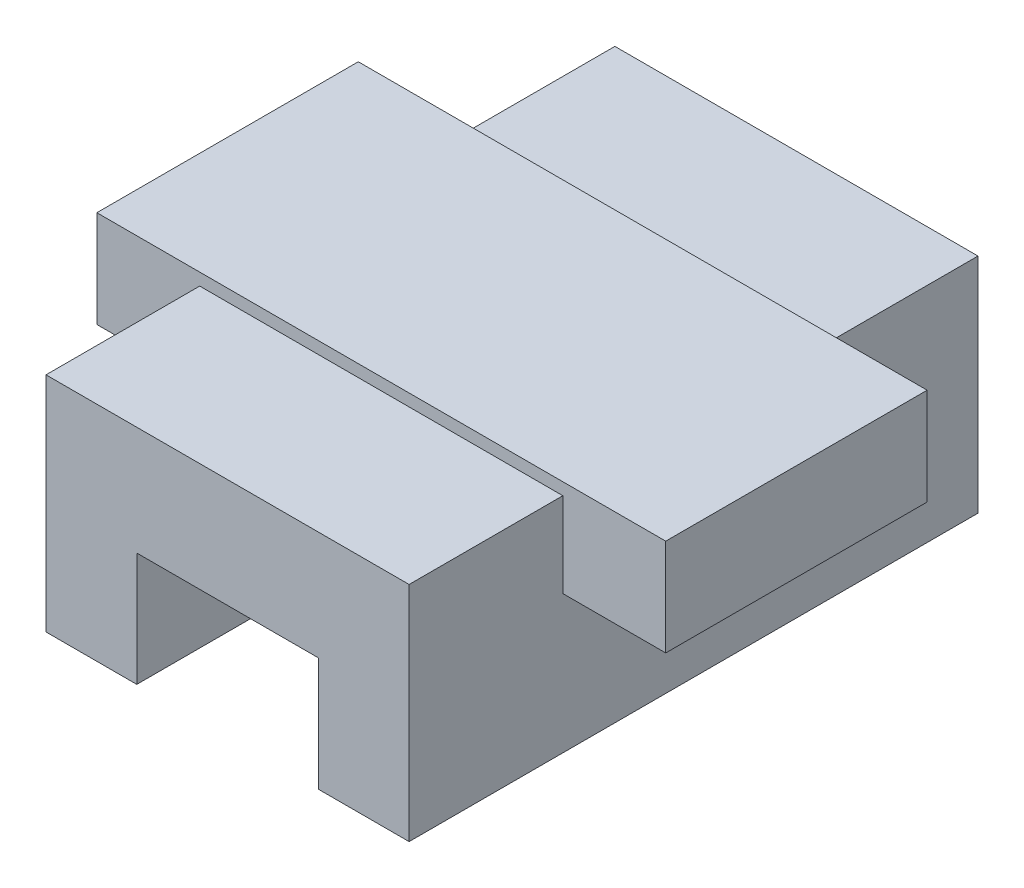
ISO-10303-21;
HEADER;
FILE_DESCRIPTION(('STEP AP214'),'2;1');
FILE_NAME('part.step','',(''),(''),'','','');
FILE_SCHEMA(('AUTOMOTIVE_DESIGN { 1 0 10303 214 1 1 1 1 }'));
ENDSEC;
DATA;
#1=APPLICATION_CONTEXT('core data for automotive mechanical design processes');
#2=APPLICATION_PROTOCOL_DEFINITION('international standard','automotive_design',2000,#1);
#3=PRODUCT_CONTEXT('',#1,'mechanical');
#4=PRODUCT('Part','Part','',(#3));
#5=PRODUCT_RELATED_PRODUCT_CATEGORY('part','',(#4));
#6=PRODUCT_DEFINITION_FORMATION('','',#4);
#7=PRODUCT_DEFINITION_CONTEXT('part definition',#1,'design');
#8=PRODUCT_DEFINITION('design','',#6,#7);
#9=PRODUCT_DEFINITION_SHAPE('','',#8);
#10=(LENGTH_UNIT() NAMED_UNIT(*) SI_UNIT(.MILLI.,.METRE.));
#11=(NAMED_UNIT(*) PLANE_ANGLE_UNIT() SI_UNIT($,.RADIAN.));
#12=(NAMED_UNIT(*) SI_UNIT($,.STERADIAN.) SOLID_ANGLE_UNIT());
#13=UNCERTAINTY_MEASURE_WITH_UNIT(LENGTH_MEASURE(1.E-05),#10,'distance_accuracy_value','');
#14=(GEOMETRIC_REPRESENTATION_CONTEXT(3) GLOBAL_UNCERTAINTY_ASSIGNED_CONTEXT((#13)) GLOBAL_UNIT_ASSIGNED_CONTEXT((#10,
#11,#12)) REPRESENTATION_CONTEXT('',''));
#15=CARTESIAN_POINT('',(0.,0.,0.));
#16=DIRECTION('',(0.,0.,1.));
#17=DIRECTION('',(1.,0.,0.));
#18=AXIS2_PLACEMENT_3D('',#15,#16,#17);
#19=CARTESIAN_POINT('',(0.,16.,23.5));
#20=DIRECTION('',(0.,-1.,0.));
#21=DIRECTION('',(1.,0.,0.));
#22=AXIS2_PLACEMENT_3D('',#19,#20,#21);
#23=PLANE('',#22);
#24=DIRECTION('',(-1.,0.,0.));
#25=VECTOR('',#24,1.);
#26=CARTESIAN_POINT('',(0.,16.,-10.8));
#27=LINE('',#26,#25);
#28=CARTESIAN_POINT('',(15.,16.,-10.8));
#29=VERTEX_POINT('',#28);
#30=CARTESIAN_POINT('',(-15.,16.,-10.8));
#31=VERTEX_POINT('',#30);
#32=EDGE_CURVE('E50',#29,#31,#27,.T.);
#33=ORIENTED_EDGE('',*,*,#32,.F.);
#34=DIRECTION('',(0.,0.,-1.));
#35=VECTOR('',#34,1.);
#36=CARTESIAN_POINT('',(15.,16.,23.5));
#37=LINE('',#36,#35);
#38=CARTESIAN_POINT('',(15.,16.,-23.5));
#39=VERTEX_POINT('',#38);
#40=EDGE_CURVE('E43',#29,#39,#37,.T.);
#41=ORIENTED_EDGE('',*,*,#40,.T.);
#42=DIRECTION('',(-1.,0.,0.));
#43=VECTOR('',#42,1.);
#44=CARTESIAN_POINT('',(0.,16.,-23.5));
#45=LINE('',#44,#43);
#46=CARTESIAN_POINT('',(-15.,16.,-23.5));
#47=VERTEX_POINT('',#46);
#48=EDGE_CURVE('E149',#39,#47,#45,.T.);
#49=ORIENTED_EDGE('',*,*,#48,.T.);
#50=DIRECTION('',(0.,0.,-1.));
#51=VECTOR('',#50,1.);
#52=CARTESIAN_POINT('',(-15.,16.,23.5));
#53=LINE('',#52,#51);
#54=EDGE_CURVE('E172',#31,#47,#53,.T.);
#55=ORIENTED_EDGE('',*,*,#54,.F.);
#56=EDGE_LOOP('',(#33,#41,#49,#55));
#57=FACE_BOUND('',#56,.T.);
#58=ADVANCED_FACE('F35',(#57),#23,.F.);
#59=CARTESIAN_POINT('',(15.,0.,23.5));
#60=DIRECTION('',(-1.,0.,0.));
#61=DIRECTION('',(0.,0.,1.));
#62=AXIS2_PLACEMENT_3D('',#59,#60,#61);
#63=PLANE('',#62);
#64=DIRECTION('',(0.,0.,-1.));
#65=VECTOR('',#64,1.);
#66=CARTESIAN_POINT('',(15.,9.,10.8));
#67=LINE('',#66,#65);
#68=CARTESIAN_POINT('',(15.,9.,10.8));
#69=VERTEX_POINT('',#68);
#70=CARTESIAN_POINT('',(15.,9.,-10.8));
#71=VERTEX_POINT('',#70);
#72=EDGE_CURVE('E205',#69,#71,#67,.T.);
#73=ORIENTED_EDGE('',*,*,#72,.F.);
#74=DIRECTION('',(0.,1.,0.));
#75=VECTOR('',#74,1.);
#76=CARTESIAN_POINT('',(15.,0.,10.8));
#77=LINE('',#76,#75);
#78=CARTESIAN_POINT('',(15.,16.,10.8));
#79=VERTEX_POINT('',#78);
#80=EDGE_CURVE('E242',#69,#79,#77,.T.);
#81=ORIENTED_EDGE('',*,*,#80,.T.);
#82=CARTESIAN_POINT('',(15.,16.,23.5));
#83=VERTEX_POINT('',#82);
#84=EDGE_CURVE('E11',#83,#79,#37,.T.);
#85=ORIENTED_EDGE('',*,*,#84,.F.);
#86=DIRECTION('',(0.,1.,0.));
#87=VECTOR('',#86,1.);
#88=CARTESIAN_POINT('',(15.,0.,23.5));
#89=LINE('',#88,#87);
#90=CARTESIAN_POINT('',(15.,-2.4,23.5));
#91=VERTEX_POINT('',#90);
#92=EDGE_CURVE('E197',#91,#83,#89,.T.);
#93=ORIENTED_EDGE('',*,*,#92,.F.);
#94=DIRECTION('',(0.,0.,-1.));
#95=VECTOR('',#94,1.);
#96=CARTESIAN_POINT('',(15.,-2.4,23.5));
#97=LINE('',#96,#95);
#98=CARTESIAN_POINT('',(15.,-2.4,-23.5));
#99=VERTEX_POINT('',#98);
#100=EDGE_CURVE('E59',#91,#99,#97,.T.);
#101=ORIENTED_EDGE('',*,*,#100,.T.);
#102=DIRECTION('',(0.,1.,0.));
#103=VECTOR('',#102,1.);
#104=CARTESIAN_POINT('',(15.,0.,-23.5));
#105=LINE('',#104,#103);
#106=EDGE_CURVE('E147',#99,#39,#105,.T.);
#107=ORIENTED_EDGE('',*,*,#106,.T.);
#108=ORIENTED_EDGE('',*,*,#40,.F.);
#109=DIRECTION('',(0.,1.,0.));
#110=VECTOR('',#109,1.);
#111=CARTESIAN_POINT('',(15.,0.,-10.8));
#112=LINE('',#111,#110);
#113=EDGE_CURVE('E226',#71,#29,#112,.T.);
#114=ORIENTED_EDGE('',*,*,#113,.F.);
#115=EDGE_LOOP('',(#73,#81,#85,#93,#101,#107,#108,#114));
#116=FACE_BOUND('',#115,.T.);
#117=ADVANCED_FACE('F37',(#116),#63,.F.);
#118=ORIENTED_EDGE('',*,*,#84,.T.);
#119=DIRECTION('',(-1.,0.,0.));
#120=VECTOR('',#119,1.);
#121=CARTESIAN_POINT('',(0.,16.,10.8));
#122=LINE('',#121,#120);
#123=CARTESIAN_POINT('',(-15.,16.,10.8));
#124=VERTEX_POINT('',#123);
#125=EDGE_CURVE('E245',#79,#124,#122,.T.);
#126=ORIENTED_EDGE('',*,*,#125,.T.);
#127=CARTESIAN_POINT('',(-15.,16.,23.5));
#128=VERTEX_POINT('',#127);
#129=EDGE_CURVE('E173',#128,#124,#53,.T.);
#130=ORIENTED_EDGE('',*,*,#129,.F.);
#131=DIRECTION('',(-1.,0.,0.));
#132=VECTOR('',#131,1.);
#133=CARTESIAN_POINT('',(0.,16.,23.5));
#134=LINE('',#133,#132);
#135=EDGE_CURVE('E98',#83,#128,#134,.T.);
#136=ORIENTED_EDGE('',*,*,#135,.F.);
#137=EDGE_LOOP('',(#118,#126,#130,#136));
#138=FACE_BOUND('',#137,.T.);
#139=ADVANCED_FACE('F306',(#138),#23,.F.);
#140=CARTESIAN_POINT('',(-15.,0.,23.5));
#141=DIRECTION('',(-1.,0.,0.));
#142=DIRECTION('',(0.,-1.,0.));
#143=AXIS2_PLACEMENT_3D('',#140,#141,#142);
#144=PLANE('',#143);
#145=DIRECTION('',(0.,1.,0.));
#146=VECTOR('',#145,1.);
#147=CARTESIAN_POINT('',(-15.,0.,10.8));
#148=LINE('',#147,#146);
#149=CARTESIAN_POINT('',(-15.,9.,10.8));
#150=VERTEX_POINT('',#149);
#151=EDGE_CURVE('E248',#150,#124,#148,.T.);
#152=ORIENTED_EDGE('',*,*,#151,.F.);
#153=DIRECTION('',(0.,0.,-1.));
#154=VECTOR('',#153,1.);
#155=CARTESIAN_POINT('',(-15.,9.,10.8));
#156=LINE('',#155,#154);
#157=CARTESIAN_POINT('',(-15.,9.,-10.8));
#158=VERTEX_POINT('',#157);
#159=EDGE_CURVE('E203',#150,#158,#156,.T.);
#160=ORIENTED_EDGE('',*,*,#159,.T.);
#161=DIRECTION('',(0.,1.,0.));
#162=VECTOR('',#161,1.);
#163=CARTESIAN_POINT('',(-15.,0.,-10.8));
#164=LINE('',#163,#162);
#165=EDGE_CURVE('E183',#158,#31,#164,.T.);
#166=ORIENTED_EDGE('',*,*,#165,.T.);
#167=ORIENTED_EDGE('',*,*,#54,.T.);
#168=DIRECTION('',(0.,1.,0.));
#169=VECTOR('',#168,1.);
#170=CARTESIAN_POINT('',(-15.,0.,-23.5));
#171=LINE('',#170,#169);
#172=CARTESIAN_POINT('',(-15.,-2.4,-23.5));
#173=VERTEX_POINT('',#172);
#174=EDGE_CURVE('E153',#173,#47,#171,.T.);
#175=ORIENTED_EDGE('',*,*,#174,.F.);
#176=DIRECTION('',(0.,0.,-1.));
#177=VECTOR('',#176,1.);
#178=CARTESIAN_POINT('',(-15.,-2.4,23.5));
#179=LINE('',#178,#177);
#180=CARTESIAN_POINT('',(-15.,-2.4,23.5));
#181=VERTEX_POINT('',#180);
#182=EDGE_CURVE('E171',#181,#173,#179,.T.);
#183=ORIENTED_EDGE('',*,*,#182,.F.);
#184=DIRECTION('',(0.,1.,0.));
#185=VECTOR('',#184,1.);
#186=CARTESIAN_POINT('',(-15.,0.,23.5));
#187=LINE('',#186,#185);
#188=EDGE_CURVE('E195',#181,#128,#187,.T.);
#189=ORIENTED_EDGE('',*,*,#188,.T.);
#190=ORIENTED_EDGE('',*,*,#129,.T.);
#191=EDGE_LOOP('',(#152,#160,#166,#167,#175,#183,#189,#190));
#192=FACE_BOUND('',#191,.T.);
#193=ADVANCED_FACE('F181',(#192),#144,.T.);
#194=CARTESIAN_POINT('',(0.,-2.4,23.5));
#195=DIRECTION('',(0.,-1.,0.));
#196=DIRECTION('',(1.,0.,0.));
#197=AXIS2_PLACEMENT_3D('',#194,#195,#196);
#198=PLANE('',#197);
#199=DIRECTION('',(-1.,0.,0.));
#200=VECTOR('',#199,1.);
#201=CARTESIAN_POINT('',(0.,-2.4,-23.5));
#202=LINE('',#201,#200);
#203=CARTESIAN_POINT('',(-7.5,-2.4,-23.5));
#204=VERTEX_POINT('',#203);
#205=EDGE_CURVE('E156',#204,#173,#202,.T.);
#206=ORIENTED_EDGE('',*,*,#205,.F.);
#207=DIRECTION('',(0.,0.,-1.));
#208=VECTOR('',#207,1.);
#209=CARTESIAN_POINT('',(-7.5,-2.4,23.5));
#210=LINE('',#209,#208);
#211=CARTESIAN_POINT('',(-7.5,-2.4,23.5));
#212=VERTEX_POINT('',#211);
#213=EDGE_CURVE('E169',#212,#204,#210,.T.);
#214=ORIENTED_EDGE('',*,*,#213,.F.);
#215=DIRECTION('',(-1.,0.,0.));
#216=VECTOR('',#215,1.);
#217=CARTESIAN_POINT('',(0.,-2.4,23.5));
#218=LINE('',#217,#216);
#219=EDGE_CURVE('E144',#212,#181,#218,.T.);
#220=ORIENTED_EDGE('',*,*,#219,.T.);
#221=ORIENTED_EDGE('',*,*,#182,.T.);
#222=EDGE_LOOP('',(#206,#214,#220,#221));
#223=FACE_BOUND('',#222,.T.);
#224=ADVANCED_FACE('F192',(#223),#198,.T.);
#225=CARTESIAN_POINT('',(-7.5,0.,23.5));
#226=DIRECTION('',(-1.,0.,0.));
#227=DIRECTION('',(0.,0.,1.));
#228=AXIS2_PLACEMENT_3D('',#225,#226,#227);
#229=PLANE('',#228);
#230=DIRECTION('',(0.,1.,0.));
#231=VECTOR('',#230,1.);
#232=CARTESIAN_POINT('',(-7.5,0.,-23.5));
#233=LINE('',#232,#231);
#234=CARTESIAN_POINT('',(-7.5,7.,-23.5));
#235=VERTEX_POINT('',#234);
#236=EDGE_CURVE('E159',#204,#235,#233,.T.);
#237=ORIENTED_EDGE('',*,*,#236,.T.);
#238=DIRECTION('',(0.,0.,-1.));
#239=VECTOR('',#238,1.);
#240=CARTESIAN_POINT('',(-7.5,7.,23.5));
#241=LINE('',#240,#239);
#242=CARTESIAN_POINT('',(-7.5,7.,23.5));
#243=VERTEX_POINT('',#242);
#244=EDGE_CURVE('E127',#243,#235,#241,.T.);
#245=ORIENTED_EDGE('',*,*,#244,.F.);
#246=DIRECTION('',(0.,1.,0.));
#247=VECTOR('',#246,1.);
#248=CARTESIAN_POINT('',(-7.5,0.,23.5));
#249=LINE('',#248,#247);
#250=EDGE_CURVE('E137',#212,#243,#249,.T.);
#251=ORIENTED_EDGE('',*,*,#250,.F.);
#252=ORIENTED_EDGE('',*,*,#213,.T.);
#253=EDGE_LOOP('',(#237,#245,#251,#252));
#254=FACE_BOUND('',#253,.T.);
#255=ADVANCED_FACE('F344',(#254),#229,.F.);
#256=CARTESIAN_POINT('',(0.,7.,23.5));
#257=DIRECTION('',(0.,-1.,0.));
#258=DIRECTION('',(1.,0.,0.));
#259=AXIS2_PLACEMENT_3D('',#256,#257,#258);
#260=PLANE('',#259);
#261=DIRECTION('',(-1.,0.,0.));
#262=VECTOR('',#261,1.);
#263=CARTESIAN_POINT('',(0.,7.,-23.5));
#264=LINE('',#263,#262);
#265=CARTESIAN_POINT('',(7.5,7.,-23.5));
#266=VERTEX_POINT('',#265);
#267=EDGE_CURVE('E122',#266,#235,#264,.T.);
#268=ORIENTED_EDGE('',*,*,#267,.F.);
#269=DIRECTION('',(0.,0.,-1.));
#270=VECTOR('',#269,1.);
#271=CARTESIAN_POINT('',(7.5,7.,23.5));
#272=LINE('',#271,#270);
#273=CARTESIAN_POINT('',(7.5,7.,23.5));
#274=VERTEX_POINT('',#273);
#275=EDGE_CURVE('E117',#274,#266,#272,.T.);
#276=ORIENTED_EDGE('',*,*,#275,.F.);
#277=DIRECTION('',(-1.,0.,0.));
#278=VECTOR('',#277,1.);
#279=CARTESIAN_POINT('',(0.,7.,23.5));
#280=LINE('',#279,#278);
#281=EDGE_CURVE('E120',#274,#243,#280,.T.);
#282=ORIENTED_EDGE('',*,*,#281,.T.);
#283=ORIENTED_EDGE('',*,*,#244,.T.);
#284=EDGE_LOOP('',(#268,#276,#282,#283));
#285=FACE_BOUND('',#284,.T.);
#286=ADVANCED_FACE('F119',(#285),#260,.T.);
#287=CARTESIAN_POINT('',(7.5,0.,23.5));
#288=DIRECTION('',(-1.,0.,0.));
#289=DIRECTION('',(0.,0.,1.));
#290=AXIS2_PLACEMENT_3D('',#287,#288,#289);
#291=PLANE('',#290);
#292=DIRECTION('',(0.,1.,0.));
#293=VECTOR('',#292,1.);
#294=CARTESIAN_POINT('',(7.5,0.,-23.5));
#295=LINE('',#294,#293);
#296=CARTESIAN_POINT('',(7.5,-2.4,-23.5));
#297=VERTEX_POINT('',#296);
#298=EDGE_CURVE('E164',#297,#266,#295,.T.);
#299=ORIENTED_EDGE('',*,*,#298,.F.);
#300=DIRECTION('',(0.,0.,-1.));
#301=VECTOR('',#300,1.);
#302=CARTESIAN_POINT('',(7.5,-2.4,23.5));
#303=LINE('',#302,#301);
#304=CARTESIAN_POINT('',(7.5,-2.4,23.5));
#305=VERTEX_POINT('',#304);
#306=EDGE_CURVE('E128',#305,#297,#303,.T.);
#307=ORIENTED_EDGE('',*,*,#306,.F.);
#308=DIRECTION('',(0.,1.,0.));
#309=VECTOR('',#308,1.);
#310=CARTESIAN_POINT('',(7.5,0.,23.5));
#311=LINE('',#310,#309);
#312=EDGE_CURVE('E134',#305,#274,#311,.T.);
#313=ORIENTED_EDGE('',*,*,#312,.T.);
#314=ORIENTED_EDGE('',*,*,#275,.T.);
#315=EDGE_LOOP('',(#299,#307,#313,#314));
#316=FACE_BOUND('',#315,.T.);
#317=ADVANCED_FACE('F140',(#316),#291,.T.);
#318=EDGE_CURVE('E160',#99,#297,#202,.T.);
#319=ORIENTED_EDGE('',*,*,#318,.F.);
#320=ORIENTED_EDGE('',*,*,#100,.F.);
#321=EDGE_CURVE('E141',#91,#305,#218,.T.);
#322=ORIENTED_EDGE('',*,*,#321,.T.);
#323=ORIENTED_EDGE('',*,*,#306,.T.);
#324=EDGE_LOOP('',(#319,#320,#322,#323));
#325=FACE_BOUND('',#324,.T.);
#326=ADVANCED_FACE('F333',(#325),#198,.T.);
#327=CARTESIAN_POINT('',(0.,0.,23.5));
#328=DIRECTION('',(0.,0.,1.));
#329=DIRECTION('',(1.,0.,0.));
#330=AXIS2_PLACEMENT_3D('',#327,#328,#329);
#331=PLANE('',#330);
#332=ORIENTED_EDGE('',*,*,#92,.T.);
#333=ORIENTED_EDGE('',*,*,#135,.T.);
#334=ORIENTED_EDGE('',*,*,#188,.F.);
#335=ORIENTED_EDGE('',*,*,#219,.F.);
#336=ORIENTED_EDGE('',*,*,#250,.T.);
#337=ORIENTED_EDGE('',*,*,#281,.F.);
#338=ORIENTED_EDGE('',*,*,#312,.F.);
#339=ORIENTED_EDGE('',*,*,#321,.F.);
#340=EDGE_LOOP('',(#332,#333,#334,#335,#336,#337,#338,#339));
#341=FACE_BOUND('',#340,.T.);
#342=ADVANCED_FACE('F132',(#341),#331,.T.);
#343=CARTESIAN_POINT('',(0.,0.,-23.5));
#344=DIRECTION('',(0.,0.,1.));
#345=DIRECTION('',(1.,0.,0.));
#346=AXIS2_PLACEMENT_3D('',#343,#344,#345);
#347=PLANE('',#346);
#348=ORIENTED_EDGE('',*,*,#106,.F.);
#349=ORIENTED_EDGE('',*,*,#318,.T.);
#350=ORIENTED_EDGE('',*,*,#298,.T.);
#351=ORIENTED_EDGE('',*,*,#267,.T.);
#352=ORIENTED_EDGE('',*,*,#236,.F.);
#353=ORIENTED_EDGE('',*,*,#205,.T.);
#354=ORIENTED_EDGE('',*,*,#174,.T.);
#355=ORIENTED_EDGE('',*,*,#48,.F.);
#356=EDGE_LOOP('',(#348,#349,#350,#351,#352,#353,#354,#355));
#357=FACE_BOUND('',#356,.T.);
#358=ADVANCED_FACE('F188',(#357),#347,.F.);
#359=CARTESIAN_POINT('',(-23.5,0.,10.8));
#360=DIRECTION('',(-1.,0.,0.));
#361=DIRECTION('',(0.,0.,1.));
#362=AXIS2_PLACEMENT_3D('',#359,#360,#361);
#363=PLANE('',#362);
#364=DIRECTION('',(0.,1.,0.));
#365=VECTOR('',#364,1.);
#366=CARTESIAN_POINT('',(-23.5,0.,-10.8));
#367=LINE('',#366,#365);
#368=CARTESIAN_POINT('',(-23.5,9.,-10.8));
#369=VERTEX_POINT('',#368);
#370=CARTESIAN_POINT('',(-23.5,17.,-10.8));
#371=VERTEX_POINT('',#370);
#372=EDGE_CURVE('E233',#369,#371,#367,.T.);
#373=ORIENTED_EDGE('',*,*,#372,.F.);
#374=DIRECTION('',(0.,0.,-1.));
#375=VECTOR('',#374,1.);
#376=CARTESIAN_POINT('',(-23.5,9.,10.8));
#377=LINE('',#376,#375);
#378=CARTESIAN_POINT('',(-23.5,9.,10.8));
#379=VERTEX_POINT('',#378);
#380=EDGE_CURVE('E150',#379,#369,#377,.T.);
#381=ORIENTED_EDGE('',*,*,#380,.F.);
#382=DIRECTION('',(0.,1.,0.));
#383=VECTOR('',#382,1.);
#384=CARTESIAN_POINT('',(-23.5,0.,10.8));
#385=LINE('',#384,#383);
#386=CARTESIAN_POINT('',(-23.5,17.,10.8));
#387=VERTEX_POINT('',#386);
#388=EDGE_CURVE('E221',#379,#387,#385,.T.);
#389=ORIENTED_EDGE('',*,*,#388,.T.);
#390=DIRECTION('',(0.,0.,-1.));
#391=VECTOR('',#390,1.);
#392=CARTESIAN_POINT('',(-23.5,17.,10.8));
#393=LINE('',#392,#391);
#394=EDGE_CURVE('E214',#387,#371,#393,.T.);
#395=ORIENTED_EDGE('',*,*,#394,.T.);
#396=EDGE_LOOP('',(#373,#381,#389,#395));
#397=FACE_BOUND('',#396,.T.);
#398=ADVANCED_FACE('F259',(#397),#363,.T.);
#399=CARTESIAN_POINT('',(0.,9.,10.8));
#400=DIRECTION('',(0.,-1.,0.));
#401=DIRECTION('',(1.,0.,0.));
#402=AXIS2_PLACEMENT_3D('',#399,#400,#401);
#403=PLANE('',#402);
#404=DIRECTION('',(-1.,0.,0.));
#405=VECTOR('',#404,1.);
#406=CARTESIAN_POINT('',(0.,9.,-10.8));
#407=LINE('',#406,#405);
#408=EDGE_CURVE('E230',#158,#369,#407,.T.);
#409=ORIENTED_EDGE('',*,*,#408,.F.);
#410=ORIENTED_EDGE('',*,*,#159,.F.);
#411=DIRECTION('',(-1.,0.,0.));
#412=VECTOR('',#411,1.);
#413=CARTESIAN_POINT('',(0.,9.,10.8));
#414=LINE('',#413,#412);
#415=EDGE_CURVE('E251',#150,#379,#414,.T.);
#416=ORIENTED_EDGE('',*,*,#415,.T.);
#417=ORIENTED_EDGE('',*,*,#380,.T.);
#418=EDGE_LOOP('',(#409,#410,#416,#417));
#419=FACE_BOUND('',#418,.T.);
#420=ADVANCED_FACE('F273',(#419),#403,.T.);
#421=CARTESIAN_POINT('',(23.5,9.,-10.8));
#422=VERTEX_POINT('',#421);
#423=EDGE_CURVE('E225',#422,#71,#407,.T.);
#424=ORIENTED_EDGE('',*,*,#423,.F.);
#425=DIRECTION('',(0.,0.,-1.));
#426=VECTOR('',#425,1.);
#427=CARTESIAN_POINT('',(23.5,9.,10.8));
#428=LINE('',#427,#426);
#429=CARTESIAN_POINT('',(23.5,9.,10.8));
#430=VERTEX_POINT('',#429);
#431=EDGE_CURVE('E208',#430,#422,#428,.T.);
#432=ORIENTED_EDGE('',*,*,#431,.F.);
#433=EDGE_CURVE('E241',#430,#69,#414,.T.);
#434=ORIENTED_EDGE('',*,*,#433,.T.);
#435=ORIENTED_EDGE('',*,*,#72,.T.);
#436=EDGE_LOOP('',(#424,#432,#434,#435));
#437=FACE_BOUND('',#436,.T.);
#438=ADVANCED_FACE('F328',(#437),#403,.T.);
#439=CARTESIAN_POINT('',(23.5,0.,10.8));
#440=DIRECTION('',(-1.,0.,0.));
#441=DIRECTION('',(0.,0.,1.));
#442=AXIS2_PLACEMENT_3D('',#439,#440,#441);
#443=PLANE('',#442);
#444=DIRECTION('',(0.,1.,0.));
#445=VECTOR('',#444,1.);
#446=CARTESIAN_POINT('',(23.5,0.,-10.8));
#447=LINE('',#446,#445);
#448=CARTESIAN_POINT('',(23.5,17.,-10.8));
#449=VERTEX_POINT('',#448);
#450=EDGE_CURVE('E222',#422,#449,#447,.T.);
#451=ORIENTED_EDGE('',*,*,#450,.T.);
#452=DIRECTION('',(0.,0.,-1.));
#453=VECTOR('',#452,1.);
#454=CARTESIAN_POINT('',(23.5,17.,10.8));
#455=LINE('',#454,#453);
#456=CARTESIAN_POINT('',(23.5,17.,10.8));
#457=VERTEX_POINT('',#456);
#458=EDGE_CURVE('E211',#457,#449,#455,.T.);
#459=ORIENTED_EDGE('',*,*,#458,.F.);
#460=DIRECTION('',(0.,1.,0.));
#461=VECTOR('',#460,1.);
#462=CARTESIAN_POINT('',(23.5,0.,10.8));
#463=LINE('',#462,#461);
#464=EDGE_CURVE('E238',#430,#457,#463,.T.);
#465=ORIENTED_EDGE('',*,*,#464,.F.);
#466=ORIENTED_EDGE('',*,*,#431,.T.);
#467=EDGE_LOOP('',(#451,#459,#465,#466));
#468=FACE_BOUND('',#467,.T.);
#469=ADVANCED_FACE('F289',(#468),#443,.F.);
#470=CARTESIAN_POINT('',(0.,17.,10.8));
#471=DIRECTION('',(0.,-1.,0.));
#472=DIRECTION('',(1.,0.,0.));
#473=AXIS2_PLACEMENT_3D('',#470,#471,#472);
#474=PLANE('',#473);
#475=DIRECTION('',(-1.,0.,0.));
#476=VECTOR('',#475,1.);
#477=CARTESIAN_POINT('',(0.,17.,-10.8));
#478=LINE('',#477,#476);
#479=EDGE_CURVE('E218',#449,#371,#478,.T.);
#480=ORIENTED_EDGE('',*,*,#479,.T.);
#481=ORIENTED_EDGE('',*,*,#394,.F.);
#482=DIRECTION('',(-1.,0.,0.));
#483=VECTOR('',#482,1.);
#484=CARTESIAN_POINT('',(0.,17.,10.8));
#485=LINE('',#484,#483);
#486=EDGE_CURVE('E217',#457,#387,#485,.T.);
#487=ORIENTED_EDGE('',*,*,#486,.F.);
#488=ORIENTED_EDGE('',*,*,#458,.T.);
#489=EDGE_LOOP('',(#480,#481,#487,#488));
#490=FACE_BOUND('',#489,.T.);
#491=ADVANCED_FACE('F296',(#490),#474,.F.);
#492=CARTESIAN_POINT('',(0.,0.,10.8));
#493=DIRECTION('',(0.,0.,1.));
#494=DIRECTION('',(1.,0.,0.));
#495=AXIS2_PLACEMENT_3D('',#492,#493,#494);
#496=PLANE('',#495);
#497=ORIENTED_EDGE('',*,*,#388,.F.);
#498=ORIENTED_EDGE('',*,*,#415,.F.);
#499=ORIENTED_EDGE('',*,*,#151,.T.);
#500=ORIENTED_EDGE('',*,*,#125,.F.);
#501=ORIENTED_EDGE('',*,*,#80,.F.);
#502=ORIENTED_EDGE('',*,*,#433,.F.);
#503=ORIENTED_EDGE('',*,*,#464,.T.);
#504=ORIENTED_EDGE('',*,*,#486,.T.);
#505=EDGE_LOOP('',(#497,#498,#499,#500,#501,#502,#503,#504));
#506=FACE_BOUND('',#505,.T.);
#507=ADVANCED_FACE('F266',(#506),#496,.T.);
#508=CARTESIAN_POINT('',(0.,0.,-10.8));
#509=DIRECTION('',(0.,0.,1.));
#510=DIRECTION('',(1.,0.,0.));
#511=AXIS2_PLACEMENT_3D('',#508,#509,#510);
#512=PLANE('',#511);
#513=ORIENTED_EDGE('',*,*,#372,.T.);
#514=ORIENTED_EDGE('',*,*,#479,.F.);
#515=ORIENTED_EDGE('',*,*,#450,.F.);
#516=ORIENTED_EDGE('',*,*,#423,.T.);
#517=ORIENTED_EDGE('',*,*,#113,.T.);
#518=ORIENTED_EDGE('',*,*,#32,.T.);
#519=ORIENTED_EDGE('',*,*,#165,.F.);
#520=ORIENTED_EDGE('',*,*,#408,.T.);
#521=EDGE_LOOP('',(#513,#514,#515,#516,#517,#518,#519,#520));
#522=FACE_BOUND('',#521,.T.);
#523=ADVANCED_FACE('F297',(#522),#512,.F.);
#524=CLOSED_SHELL('',(#58,#117,#139,#193,#224,#255,#286,#317,#326,#342,#358,#398,#420,#438,#469,
#491,#507,#523));
#525=MANIFOLD_SOLID_BREP('B2',#524);
#526=ADVANCED_BREP_SHAPE_REPRESENTATION('',(#18,#525),#14);
#527=SHAPE_DEFINITION_REPRESENTATION(#9,#526);
ENDSEC;
END-ISO-10303-21;
